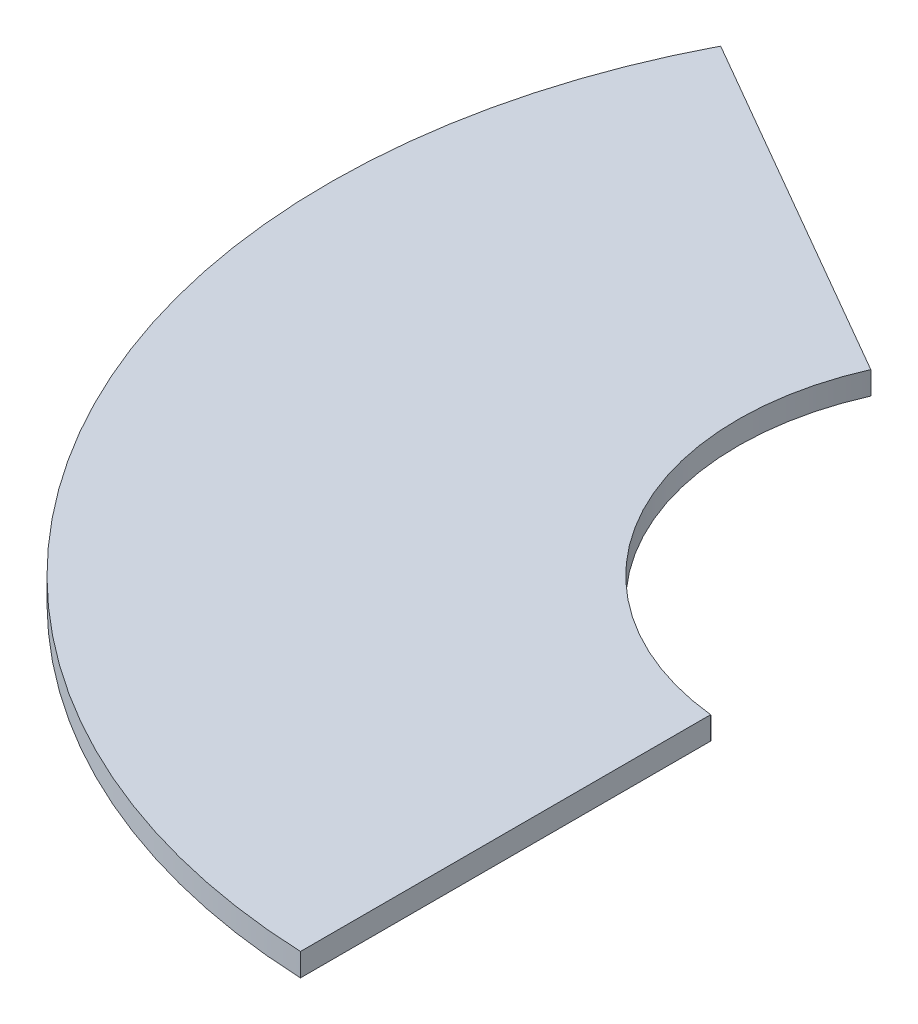
ISO-10303-21;
HEADER;
FILE_DESCRIPTION(('STEP AP214'),'2;1');
FILE_NAME('part.step','',(''),(''),'','','');
FILE_SCHEMA(('AUTOMOTIVE_DESIGN { 1 0 10303 214 1 1 1 1 }'));
ENDSEC;
DATA;
#1=APPLICATION_CONTEXT('core data for automotive mechanical design processes');
#2=APPLICATION_PROTOCOL_DEFINITION('international standard','automotive_design',2000,#1);
#3=PRODUCT_CONTEXT('',#1,'mechanical');
#4=PRODUCT('Part','Part','',(#3));
#5=PRODUCT_RELATED_PRODUCT_CATEGORY('part','',(#4));
#6=PRODUCT_DEFINITION_FORMATION('','',#4);
#7=PRODUCT_DEFINITION_CONTEXT('part definition',#1,'design');
#8=PRODUCT_DEFINITION('design','',#6,#7);
#9=PRODUCT_DEFINITION_SHAPE('','',#8);
#10=(LENGTH_UNIT() NAMED_UNIT(*) SI_UNIT(.MILLI.,.METRE.));
#11=(NAMED_UNIT(*) PLANE_ANGLE_UNIT() SI_UNIT($,.RADIAN.));
#12=(NAMED_UNIT(*) SI_UNIT($,.STERADIAN.) SOLID_ANGLE_UNIT());
#13=UNCERTAINTY_MEASURE_WITH_UNIT(LENGTH_MEASURE(1.E-05),#10,'distance_accuracy_value','');
#14=(GEOMETRIC_REPRESENTATION_CONTEXT(3) GLOBAL_UNCERTAINTY_ASSIGNED_CONTEXT((#13)) GLOBAL_UNIT_ASSIGNED_CONTEXT((#10,
#11,#12)) REPRESENTATION_CONTEXT('',''));
#15=CARTESIAN_POINT('',(0.,0.,0.));
#16=DIRECTION('',(0.,0.,1.));
#17=DIRECTION('',(1.,0.,0.));
#18=AXIS2_PLACEMENT_3D('',#15,#16,#17);
#19=CARTESIAN_POINT('',(0.,145.863295464487,0.));
#20=DIRECTION('',(0.,1.,0.));
#21=DIRECTION('',(0.,0.,1.));
#22=AXIS2_PLACEMENT_3D('',#19,#20,#21);
#23=CYLINDRICAL_SURFACE('',#22,33.7212763077138);
#24=CARTESIAN_POINT('',(0.,146.999,0.));
#25=DIRECTION('',(0.,1.,0.));
#26=DIRECTION('',(-0.886504057005299,0.,-0.46272081962361));
#27=AXIS2_PLACEMENT_3D('',#24,#25,#26);
#28=CIRCLE('',#27,33.7212763077138);
#29=CARTESIAN_POINT('',(-29.8940482541849,146.999,-15.6035366118595));
#30=VERTEX_POINT('',#29);
#31=CARTESIAN_POINT('',(-1.43396503234122,146.999,33.6907735160118));
#32=VERTEX_POINT('',#31);
#33=EDGE_CURVE('E112',#30,#32,#28,.T.);
#34=ORIENTED_EDGE('',*,*,#33,.F.);
#35=DIRECTION('',(0.,1.,0.));
#36=VECTOR('',#35,1.);
#37=CARTESIAN_POINT('',(-29.8940482541849,145.863295464487,-15.6035366118595));
#38=LINE('',#37,#36);
#39=CARTESIAN_POINT('',(-29.8940482541849,145.863295464487,-15.6035366118595));
#40=VERTEX_POINT('',#39);
#41=EDGE_CURVE('E32',#40,#30,#38,.T.);
#42=ORIENTED_EDGE('',*,*,#41,.F.);
#43=CARTESIAN_POINT('',(0.,145.863295464487,0.));
#44=DIRECTION('',(0.,1.,0.));
#45=DIRECTION('',(-0.886504057005299,0.,-0.46272081962361));
#46=AXIS2_PLACEMENT_3D('',#43,#44,#45);
#47=CIRCLE('',#46,33.7212763077138);
#48=CARTESIAN_POINT('',(-1.43396503234122,145.863295464487,33.6907735160118));
#49=VERTEX_POINT('',#48);
#50=EDGE_CURVE('E132',#40,#49,#47,.T.);
#51=ORIENTED_EDGE('',*,*,#50,.T.);
#52=DIRECTION('',(0.,1.,0.));
#53=VECTOR('',#52,1.);
#54=CARTESIAN_POINT('',(-1.43396503234122,145.863295464487,33.6907735160118));
#55=LINE('',#54,#53);
#56=EDGE_CURVE('E10',#49,#32,#55,.T.);
#57=ORIENTED_EDGE('',*,*,#56,.T.);
#58=EDGE_LOOP('',(#34,#42,#51,#57));
#59=FACE_BOUND('',#58,.T.);
#60=ADVANCED_FACE('F16',(#59),#23,.T.);
#61=CARTESIAN_POINT('',(-1.99999999999999,145.863295464487,33.0894931879131));
#62=DIRECTION('',(-0.728125004038109,0.,0.685444365717965));
#63=DIRECTION('',(0.685444365717965,0.,0.728125004038109));
#64=AXIS2_PLACEMENT_3D('',#61,#62,#63);
#65=PLANE('',#64);
#66=DIRECTION('',(0.685444365717965,0.,0.728125004038109));
#67=VECTOR('',#66,1.);
#68=CARTESIAN_POINT('',(-1.99999999999999,146.999,33.0894931879131));
#69=LINE('',#68,#67);
#70=CARTESIAN_POINT('',(-1.42860392484438,146.999,33.6964684441679));
#71=VERTEX_POINT('',#70);
#72=EDGE_CURVE('E115',#32,#71,#69,.T.);
#73=ORIENTED_EDGE('',*,*,#72,.F.);
#74=ORIENTED_EDGE('',*,*,#56,.F.);
#75=DIRECTION('',(0.685444365717965,0.,0.728125004038109));
#76=VECTOR('',#75,1.);
#77=CARTESIAN_POINT('',(-1.99999999999999,145.863295464487,33.0894931879131));
#78=LINE('',#77,#76);
#79=CARTESIAN_POINT('',(-1.42860392484438,145.863295464487,33.6964684441679));
#80=VERTEX_POINT('',#79);
#81=EDGE_CURVE('E141',#49,#80,#78,.T.);
#82=ORIENTED_EDGE('',*,*,#81,.T.);
#83=DIRECTION('',(0.,1.,0.));
#84=VECTOR('',#83,1.);
#85=CARTESIAN_POINT('',(-1.42860392484438,145.863295464487,33.6964684441679));
#86=LINE('',#85,#84);
#87=EDGE_CURVE('E24',#80,#71,#86,.T.);
#88=ORIENTED_EDGE('',*,*,#87,.T.);
#89=EDGE_LOOP('',(#73,#74,#82,#88));
#90=FACE_BOUND('',#89,.T.);
#91=ADVANCED_FACE('F140',(#90),#65,.T.);
#92=CARTESIAN_POINT('',(-1.42860392484439,145.863295464487,33.6964684441679));
#93=DIRECTION('',(1.,0.,0.));
#94=DIRECTION('',(0.,0.,-1.));
#95=AXIS2_PLACEMENT_3D('',#92,#93,#94);
#96=PLANE('',#95);
#97=DIRECTION('',(0.,0.,-1.));
#98=VECTOR('',#97,1.);
#99=CARTESIAN_POINT('',(-1.42860392484439,146.999,33.6964684441679));
#100=LINE('',#99,#98);
#101=CARTESIAN_POINT('',(-1.4286039248444,146.999,13.3615629438436));
#102=VERTEX_POINT('',#101);
#103=EDGE_CURVE('E118',#71,#102,#100,.T.);
#104=ORIENTED_EDGE('',*,*,#103,.F.);
#105=ORIENTED_EDGE('',*,*,#87,.F.);
#106=DIRECTION('',(0.,0.,-1.));
#107=VECTOR('',#106,1.);
#108=CARTESIAN_POINT('',(-1.42860392484439,145.863295464487,33.6964684441679));
#109=LINE('',#108,#107);
#110=CARTESIAN_POINT('',(-1.4286039248444,145.863295464487,13.3615629438436));
#111=VERTEX_POINT('',#110);
#112=EDGE_CURVE('E150',#80,#111,#109,.T.);
#113=ORIENTED_EDGE('',*,*,#112,.T.);
#114=DIRECTION('',(0.,1.,0.));
#115=VECTOR('',#114,1.);
#116=CARTESIAN_POINT('',(-1.4286039248444,145.863295464487,13.3615629438436));
#117=LINE('',#116,#115);
#118=EDGE_CURVE('E138',#111,#102,#117,.T.);
#119=ORIENTED_EDGE('',*,*,#118,.T.);
#120=EDGE_LOOP('',(#104,#105,#113,#119));
#121=FACE_BOUND('',#120,.T.);
#122=ADVANCED_FACE('F145',(#121),#96,.T.);
#123=CARTESIAN_POINT('',(-2.,145.863295464487,13.856406460551));
#124=DIRECTION('',(0.654653670707978,0.,0.755928946018454));
#125=DIRECTION('',(0.755928946018454,0.,-0.654653670707978));
#126=AXIS2_PLACEMENT_3D('',#123,#124,#125);
#127=PLANE('',#126);
#128=DIRECTION('',(0.755928946018454,0.,-0.654653670707978));
#129=VECTOR('',#128,1.);
#130=CARTESIAN_POINT('',(-2.,146.999,13.856406460551));
#131=LINE('',#130,#129);
#132=CARTESIAN_POINT('',(-1.41917990733078,146.999,13.3534015052711));
#133=VERTEX_POINT('',#132);
#134=EDGE_CURVE('E121',#102,#133,#131,.T.);
#135=ORIENTED_EDGE('',*,*,#134,.F.);
#136=ORIENTED_EDGE('',*,*,#118,.F.);
#137=DIRECTION('',(0.755928946018454,0.,-0.654653670707978));
#138=VECTOR('',#137,1.);
#139=CARTESIAN_POINT('',(-2.,145.863295464487,13.856406460551));
#140=LINE('',#139,#138);
#141=CARTESIAN_POINT('',(-1.41917990733078,145.863295464487,13.3534015052711));
#142=VERTEX_POINT('',#141);
#143=EDGE_CURVE('E154',#111,#142,#140,.T.);
#144=ORIENTED_EDGE('',*,*,#143,.T.);
#145=DIRECTION('',(0.,1.,0.));
#146=VECTOR('',#145,1.);
#147=CARTESIAN_POINT('',(-1.41917990733078,145.863295464487,13.3534015052711));
#148=LINE('',#147,#146);
#149=EDGE_CURVE('E136',#142,#133,#148,.T.);
#150=ORIENTED_EDGE('',*,*,#149,.T.);
#151=EDGE_LOOP('',(#135,#136,#144,#150));
#152=FACE_BOUND('',#151,.T.);
#153=ADVANCED_FACE('F161',(#152),#127,.T.);
#154=CARTESIAN_POINT('',(0.,145.863295464487,0.));
#155=DIRECTION('',(0.,1.,0.));
#156=DIRECTION('',(0.,0.,1.));
#157=AXIS2_PLACEMENT_3D('',#154,#155,#156);
#158=CYLINDRICAL_SURFACE('',#157,13.4286039248444);
#159=CARTESIAN_POINT('',(0.,146.999,0.));
#160=DIRECTION('',(0.,-1.,0.));
#161=DIRECTION('',(-0.105683354373505,0.,0.994399833371046));
#162=AXIS2_PLACEMENT_3D('',#159,#160,#161);
#163=CIRCLE('',#162,13.4286039248444);
#164=CARTESIAN_POINT('',(-12.2739748841635,146.999,-5.44765490034648));
#165=VERTEX_POINT('',#164);
#166=EDGE_CURVE('E124',#133,#165,#163,.T.);
#167=ORIENTED_EDGE('',*,*,#166,.F.);
#168=ORIENTED_EDGE('',*,*,#149,.F.);
#169=CARTESIAN_POINT('',(0.,145.863295464487,0.));
#170=DIRECTION('',(0.,-1.,0.));
#171=DIRECTION('',(-0.105683354373505,0.,0.994399833371046));
#172=AXIS2_PLACEMENT_3D('',#169,#170,#171);
#173=CIRCLE('',#172,13.4286039248444);
#174=CARTESIAN_POINT('',(-12.2739748841635,145.863295464487,-5.44765490034648));
#175=VERTEX_POINT('',#174);
#176=EDGE_CURVE('E103',#142,#175,#173,.T.);
#177=ORIENTED_EDGE('',*,*,#176,.T.);
#178=DIRECTION('',(0.,1.,0.));
#179=VECTOR('',#178,1.);
#180=CARTESIAN_POINT('',(-12.2739748841635,145.863295464487,-5.44765490034648));
#181=LINE('',#180,#179);
#182=EDGE_CURVE('E95',#175,#165,#181,.T.);
#183=ORIENTED_EDGE('',*,*,#182,.T.);
#184=EDGE_LOOP('',(#167,#168,#177,#183));
#185=FACE_BOUND('',#184,.T.);
#186=ADVANCED_FACE('F158',(#185),#158,.F.);
#187=CARTESIAN_POINT('',(-13.0000000000001,145.863295464487,-5.19615242270648));
#188=DIRECTION('',(-0.327326835353995,0.,-0.944911182523066));
#189=DIRECTION('',(-0.944911182523066,0.,0.327326835353995));
#190=AXIS2_PLACEMENT_3D('',#187,#188,#189);
#191=PLANE('',#190);
#192=DIRECTION('',(-0.944911182523066,0.,0.327326835353995));
#193=VECTOR('',#192,1.);
#194=CARTESIAN_POINT('',(-13.0000000000001,146.999,-5.19615242270648));
#195=LINE('',#194,#193);
#196=CARTESIAN_POINT('',(-12.2857549060555,146.999,-5.44357418106023));
#197=VERTEX_POINT('',#196);
#198=EDGE_CURVE('E127',#165,#197,#195,.T.);
#199=ORIENTED_EDGE('',*,*,#198,.F.);
#200=ORIENTED_EDGE('',*,*,#182,.F.);
#201=DIRECTION('',(-0.944911182523066,0.,0.327326835353995));
#202=VECTOR('',#201,1.);
#203=CARTESIAN_POINT('',(-13.0000000000001,145.863295464487,-5.19615242270648));
#204=LINE('',#203,#202);
#205=CARTESIAN_POINT('',(-12.2857549060555,145.863295464487,-5.44357418106023));
#206=VERTEX_POINT('',#205);
#207=EDGE_CURVE('E98',#175,#206,#204,.T.);
#208=ORIENTED_EDGE('',*,*,#207,.T.);
#209=DIRECTION('',(0.,1.,0.));
#210=VECTOR('',#209,1.);
#211=CARTESIAN_POINT('',(-12.2857549060555,145.863295464487,-5.44357418106023));
#212=LINE('',#211,#210);
#213=EDGE_CURVE('E84',#206,#197,#212,.T.);
#214=ORIENTED_EDGE('',*,*,#213,.T.);
#215=EDGE_LOOP('',(#199,#200,#208,#214));
#216=FACE_BOUND('',#215,.T.);
#217=ADVANCED_FACE('F99',(#216),#191,.T.);
#218=CARTESIAN_POINT('',(-12.2857549060555,145.863295464487,-5.44357418106023));
#219=DIRECTION('',(0.499999999999992,0.,-0.866025403784443));
#220=DIRECTION('',(-0.866025403784444,0.,-0.499999999999992));
#221=AXIS2_PLACEMENT_3D('',#218,#219,#220);
#222=PLANE('',#221);
#223=DIRECTION('',(-0.866025403784443,0.,-0.499999999999992));
#224=VECTOR('',#223,1.);
#225=CARTESIAN_POINT('',(-12.2857549060555,146.999,-5.44357418106023));
#226=LINE('',#225,#224);
#227=CARTESIAN_POINT('',(-29.8962996528924,146.999,-15.6110269312222));
#228=VERTEX_POINT('',#227);
#229=EDGE_CURVE('E91',#197,#228,#226,.T.);
#230=ORIENTED_EDGE('',*,*,#229,.F.);
#231=ORIENTED_EDGE('',*,*,#213,.F.);
#232=DIRECTION('',(-0.866025403784443,0.,-0.499999999999992));
#233=VECTOR('',#232,1.);
#234=CARTESIAN_POINT('',(-12.2857549060555,145.863295464487,-5.44357418106023));
#235=LINE('',#234,#233);
#236=CARTESIAN_POINT('',(-29.8962996528924,145.863295464487,-15.6110269312222));
#237=VERTEX_POINT('',#236);
#238=EDGE_CURVE('E88',#206,#237,#235,.T.);
#239=ORIENTED_EDGE('',*,*,#238,.T.);
#240=DIRECTION('',(0.,1.,0.));
#241=VECTOR('',#240,1.);
#242=CARTESIAN_POINT('',(-29.8962996528924,145.863295464487,-15.6110269312222));
#243=LINE('',#242,#241);
#244=EDGE_CURVE('E60',#237,#228,#243,.T.);
#245=ORIENTED_EDGE('',*,*,#244,.T.);
#246=EDGE_LOOP('',(#230,#231,#239,#245));
#247=FACE_BOUND('',#246,.T.);
#248=ADVANCED_FACE('F86',(#247),#222,.T.);
#249=CARTESIAN_POINT('',(-29.8962996528924,145.863295464487,-15.6110269312222));
#250=DIRECTION('',(-0.957674735611722,0.,0.287852567768672));
#251=DIRECTION('',(0.287852567768673,0.,0.957674735611722));
#252=AXIS2_PLACEMENT_3D('',#249,#250,#251);
#253=PLANE('',#252);
#254=DIRECTION('',(0.287852567768673,0.,0.957674735611722));
#255=VECTOR('',#254,1.);
#256=CARTESIAN_POINT('',(-29.8962996528924,146.999,-15.6110269312222));
#257=LINE('',#256,#255);
#258=EDGE_CURVE('E130',#228,#30,#257,.T.);
#259=ORIENTED_EDGE('',*,*,#258,.F.);
#260=ORIENTED_EDGE('',*,*,#244,.F.);
#261=DIRECTION('',(0.287852567768673,0.,0.957674735611722));
#262=VECTOR('',#261,1.);
#263=CARTESIAN_POINT('',(-29.8962996528924,145.863295464487,-15.6110269312222));
#264=LINE('',#263,#262);
#265=EDGE_CURVE('E107',#237,#40,#264,.T.);
#266=ORIENTED_EDGE('',*,*,#265,.T.);
#267=ORIENTED_EDGE('',*,*,#41,.T.);
#268=EDGE_LOOP('',(#259,#260,#266,#267));
#269=FACE_BOUND('',#268,.T.);
#270=ADVANCED_FACE('F217',(#269),#253,.T.);
#271=CARTESIAN_POINT('',(0.,145.863295464487,-33.15));
#272=DIRECTION('',(0.,1.,0.));
#273=DIRECTION('',(-1.,0.,0.));
#274=AXIS2_PLACEMENT_3D('',#271,#272,#273);
#275=PLANE('',#274);
#276=ORIENTED_EDGE('',*,*,#50,.F.);
#277=ORIENTED_EDGE('',*,*,#265,.F.);
#278=ORIENTED_EDGE('',*,*,#238,.F.);
#279=ORIENTED_EDGE('',*,*,#207,.F.);
#280=ORIENTED_EDGE('',*,*,#176,.F.);
#281=ORIENTED_EDGE('',*,*,#143,.F.);
#282=ORIENTED_EDGE('',*,*,#112,.F.);
#283=ORIENTED_EDGE('',*,*,#81,.F.);
#284=EDGE_LOOP('',(#276,#277,#278,#279,#280,#281,#282,#283));
#285=FACE_BOUND('',#284,.T.);
#286=ADVANCED_FACE('F106',(#285),#275,.F.);
#287=CARTESIAN_POINT('',(0.,146.999,-33.15));
#288=DIRECTION('',(0.,1.,0.));
#289=DIRECTION('',(-1.,0.,0.));
#290=AXIS2_PLACEMENT_3D('',#287,#288,#289);
#291=PLANE('',#290);
#292=ORIENTED_EDGE('',*,*,#33,.T.);
#293=ORIENTED_EDGE('',*,*,#72,.T.);
#294=ORIENTED_EDGE('',*,*,#103,.T.);
#295=ORIENTED_EDGE('',*,*,#134,.T.);
#296=ORIENTED_EDGE('',*,*,#166,.T.);
#297=ORIENTED_EDGE('',*,*,#198,.T.);
#298=ORIENTED_EDGE('',*,*,#229,.T.);
#299=ORIENTED_EDGE('',*,*,#258,.T.);
#300=EDGE_LOOP('',(#292,#293,#294,#295,#296,#297,#298,#299));
#301=FACE_BOUND('',#300,.T.);
#302=ADVANCED_FACE('F148',(#301),#291,.T.);
#303=CLOSED_SHELL('',(#60,#91,#122,#153,#186,#217,#248,#270,#286,#302));
#304=MANIFOLD_SOLID_BREP('B1',#303);
#305=ADVANCED_BREP_SHAPE_REPRESENTATION('',(#18,#304),#14);
#306=SHAPE_DEFINITION_REPRESENTATION(#9,#305);
ENDSEC;
END-ISO-10303-21;
